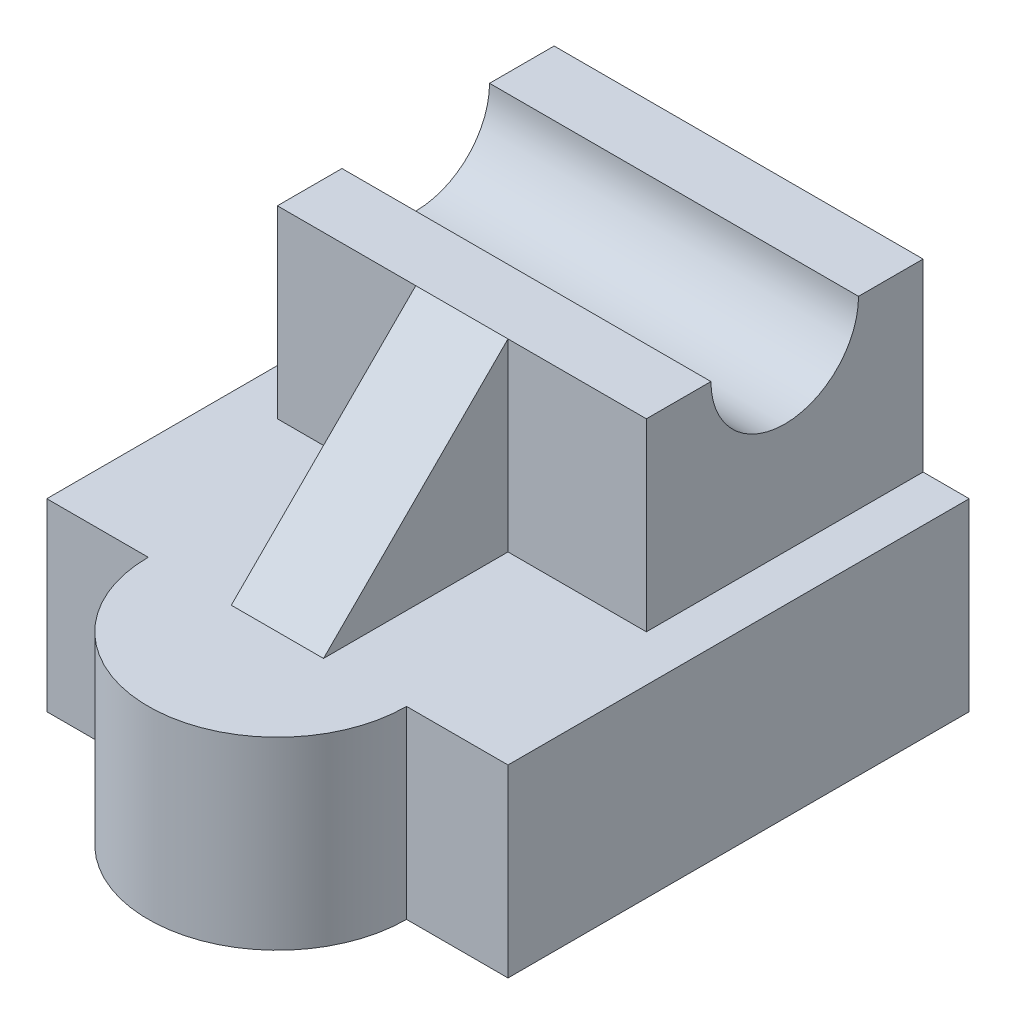
ISO-10303-21;
HEADER;
FILE_DESCRIPTION(('STEP AP214'),'2;1');
FILE_NAME('part.step','',(''),(''),'','','');
FILE_SCHEMA(('AUTOMOTIVE_DESIGN { 1 0 10303 214 1 1 1 1 }'));
ENDSEC;
DATA;
#1=APPLICATION_CONTEXT('core data for automotive mechanical design processes');
#2=APPLICATION_PROTOCOL_DEFINITION('international standard','automotive_design',2000,#1);
#3=PRODUCT_CONTEXT('',#1,'mechanical');
#4=PRODUCT('Part','Part','',(#3));
#5=PRODUCT_RELATED_PRODUCT_CATEGORY('part','',(#4));
#6=PRODUCT_DEFINITION_FORMATION('','',#4);
#7=PRODUCT_DEFINITION_CONTEXT('part definition',#1,'design');
#8=PRODUCT_DEFINITION('design','',#6,#7);
#9=PRODUCT_DEFINITION_SHAPE('','',#8);
#10=(LENGTH_UNIT() NAMED_UNIT(*) SI_UNIT(.MILLI.,.METRE.));
#11=(NAMED_UNIT(*) PLANE_ANGLE_UNIT() SI_UNIT($,.RADIAN.));
#12=(NAMED_UNIT(*) SI_UNIT($,.STERADIAN.) SOLID_ANGLE_UNIT());
#13=UNCERTAINTY_MEASURE_WITH_UNIT(LENGTH_MEASURE(1.E-05),#10,'distance_accuracy_value','');
#14=(GEOMETRIC_REPRESENTATION_CONTEXT(3) GLOBAL_UNCERTAINTY_ASSIGNED_CONTEXT((#13)) GLOBAL_UNIT_ASSIGNED_CONTEXT((#10,
#11,#12)) REPRESENTATION_CONTEXT('',''));
#15=CARTESIAN_POINT('',(0.,0.,0.));
#16=DIRECTION('',(0.,0.,1.));
#17=DIRECTION('',(1.,0.,0.));
#18=AXIS2_PLACEMENT_3D('',#15,#16,#17);
#19=CARTESIAN_POINT('',(20.,40.,30.));
#20=DIRECTION('',(0.,0.,-1.));
#21=DIRECTION('',(-1.,0.,0.));
#22=AXIS2_PLACEMENT_3D('',#19,#20,#21);
#23=PLANE('',#22);
#24=DIRECTION('',(0.,1.,0.));
#25=VECTOR('',#24,1.);
#26=CARTESIAN_POINT('',(5.,20.,30.));
#27=LINE('',#26,#25);
#28=CARTESIAN_POINT('',(5.,20.,30.));
#29=VERTEX_POINT('',#28);
#30=CARTESIAN_POINT('',(5.,40.,30.));
#31=VERTEX_POINT('',#30);
#32=EDGE_CURVE('E165',#29,#31,#27,.T.);
#33=ORIENTED_EDGE('',*,*,#32,.F.);
#34=DIRECTION('',(1.,0.,0.));
#35=VECTOR('',#34,1.);
#36=CARTESIAN_POINT('',(20.,20.,30.));
#37=LINE('',#36,#35);
#38=CARTESIAN_POINT('',(20.,20.,30.));
#39=VERTEX_POINT('',#38);
#40=EDGE_CURVE('E157',#29,#39,#37,.T.);
#41=ORIENTED_EDGE('',*,*,#40,.T.);
#42=DIRECTION('',(0.,-1.,0.));
#43=VECTOR('',#42,1.);
#44=CARTESIAN_POINT('',(20.,40.,30.));
#45=LINE('',#44,#43);
#46=CARTESIAN_POINT('',(20.,40.,30.));
#47=VERTEX_POINT('',#46);
#48=EDGE_CURVE('E226',#47,#39,#45,.T.);
#49=ORIENTED_EDGE('',*,*,#48,.F.);
#50=DIRECTION('',(1.,0.,0.));
#51=VECTOR('',#50,1.);
#52=CARTESIAN_POINT('',(20.,40.,30.));
#53=LINE('',#52,#51);
#54=EDGE_CURVE('E59',#31,#47,#53,.T.);
#55=ORIENTED_EDGE('',*,*,#54,.F.);
#56=EDGE_LOOP('',(#33,#41,#49,#55));
#57=FACE_BOUND('',#56,.T.);
#58=ADVANCED_FACE('F43',(#57),#23,.F.);
#59=CARTESIAN_POINT('',(0.,0.,50.));
#60=DIRECTION('',(0.,0.,1.));
#61=DIRECTION('',(1.,0.,0.));
#62=AXIS2_PLACEMENT_3D('',#59,#60,#61);
#63=PLANE('',#62);
#64=DIRECTION('',(1.,0.,0.));
#65=VECTOR('',#64,1.);
#66=CARTESIAN_POINT('',(-25.,0.,50.));
#67=LINE('',#66,#65);
#68=CARTESIAN_POINT('',(-25.,0.,50.));
#69=VERTEX_POINT('',#68);
#70=CARTESIAN_POINT('',(-14.,0.,50.));
#71=VERTEX_POINT('',#70);
#72=EDGE_CURVE('E236',#69,#71,#67,.T.);
#73=ORIENTED_EDGE('',*,*,#72,.T.);
#74=DIRECTION('',(0.,1.,0.));
#75=VECTOR('',#74,1.);
#76=CARTESIAN_POINT('',(-14.,0.,50.));
#77=LINE('',#76,#75);
#78=CARTESIAN_POINT('',(-14.,20.,50.));
#79=VERTEX_POINT('',#78);
#80=EDGE_CURVE('E186',#71,#79,#77,.T.);
#81=ORIENTED_EDGE('',*,*,#80,.T.);
#82=DIRECTION('',(-1.,0.,0.));
#83=VECTOR('',#82,1.);
#84=CARTESIAN_POINT('',(25.,20.,50.));
#85=LINE('',#84,#83);
#86=CARTESIAN_POINT('',(-25.,20.,50.));
#87=VERTEX_POINT('',#86);
#88=EDGE_CURVE('E242',#79,#87,#85,.T.);
#89=ORIENTED_EDGE('',*,*,#88,.T.);
#90=DIRECTION('',(0.,-1.,0.));
#91=VECTOR('',#90,1.);
#92=CARTESIAN_POINT('',(-25.,20.,50.));
#93=LINE('',#92,#91);
#94=EDGE_CURVE('E234',#87,#69,#93,.T.);
#95=ORIENTED_EDGE('',*,*,#94,.T.);
#96=EDGE_LOOP('',(#73,#81,#89,#95));
#97=FACE_BOUND('',#96,.T.);
#98=ADVANCED_FACE('F296',(#97),#63,.T.);
#99=CARTESIAN_POINT('',(0.,40.,0.));
#100=DIRECTION('',(0.,-1.,0.));
#101=DIRECTION('',(0.,0.,-1.));
#102=AXIS2_PLACEMENT_3D('',#99,#100,#101);
#103=PLANE('',#102);
#104=DIRECTION('',(1.,0.,0.));
#105=VECTOR('',#104,1.);
#106=CARTESIAN_POINT('',(-25.,40.,23.));
#107=LINE('',#106,#105);
#108=CARTESIAN_POINT('',(-20.,40.,23.));
#109=VERTEX_POINT('',#108);
#110=CARTESIAN_POINT('',(20.,40.,23.));
#111=VERTEX_POINT('',#110);
#112=EDGE_CURVE('E194',#109,#111,#107,.T.);
#113=ORIENTED_EDGE('',*,*,#112,.F.);
#114=DIRECTION('',(0.,0.,1.));
#115=VECTOR('',#114,1.);
#116=CARTESIAN_POINT('',(-20.,40.,30.));
#117=LINE('',#116,#115);
#118=CARTESIAN_POINT('',(-20.,40.,30.));
#119=VERTEX_POINT('',#118);
#120=EDGE_CURVE('E204',#109,#119,#117,.T.);
#121=ORIENTED_EDGE('',*,*,#120,.T.);
#122=CARTESIAN_POINT('',(-5.,40.,30.));
#123=VERTEX_POINT('',#122);
#124=EDGE_CURVE('E202',#119,#123,#53,.T.);
#125=ORIENTED_EDGE('',*,*,#124,.T.);
#126=DIRECTION('',(-1.,0.,0.));
#127=VECTOR('',#126,1.);
#128=CARTESIAN_POINT('',(5.,40.,30.));
#129=LINE('',#128,#127);
#130=EDGE_CURVE('E173',#31,#123,#129,.T.);
#131=ORIENTED_EDGE('',*,*,#130,.F.);
#132=ORIENTED_EDGE('',*,*,#54,.T.);
#133=DIRECTION('',(0.,0.,-1.));
#134=VECTOR('',#133,1.);
#135=CARTESIAN_POINT('',(20.,40.,0.));
#136=LINE('',#135,#134);
#137=EDGE_CURVE('E208',#47,#111,#136,.T.);
#138=ORIENTED_EDGE('',*,*,#137,.T.);
#139=EDGE_LOOP('',(#113,#121,#125,#131,#132,#138));
#140=FACE_BOUND('',#139,.T.);
#141=ADVANCED_FACE('F304',(#140),#103,.F.);
#142=CARTESIAN_POINT('',(20.,40.,0.));
#143=DIRECTION('',(-1.,0.,0.));
#144=DIRECTION('',(0.,0.,1.));
#145=AXIS2_PLACEMENT_3D('',#142,#143,#144);
#146=PLANE('',#145);
#147=CARTESIAN_POINT('',(20.,40.,15.));
#148=DIRECTION('',(1.,0.,0.));
#149=DIRECTION('',(0.,0.,1.));
#150=AXIS2_PLACEMENT_3D('',#147,#148,#149);
#151=CIRCLE('',#150,8.);
#152=CARTESIAN_POINT('',(20.,40.,7.));
#153=VERTEX_POINT('',#152);
#154=EDGE_CURVE('E188',#111,#153,#151,.T.);
#155=ORIENTED_EDGE('',*,*,#154,.F.);
#156=ORIENTED_EDGE('',*,*,#137,.F.);
#157=ORIENTED_EDGE('',*,*,#48,.T.);
#158=DIRECTION('',(0.,0.,-1.));
#159=VECTOR('',#158,1.);
#160=CARTESIAN_POINT('',(20.,20.,0.));
#161=LINE('',#160,#159);
#162=CARTESIAN_POINT('',(20.,20.,0.));
#163=VERTEX_POINT('',#162);
#164=EDGE_CURVE('E217',#39,#163,#161,.T.);
#165=ORIENTED_EDGE('',*,*,#164,.T.);
#166=DIRECTION('',(0.,-1.,0.));
#167=VECTOR('',#166,1.);
#168=CARTESIAN_POINT('',(20.,40.,0.));
#169=LINE('',#168,#167);
#170=CARTESIAN_POINT('',(20.,40.,0.));
#171=VERTEX_POINT('',#170);
#172=EDGE_CURVE('E224',#171,#163,#169,.T.);
#173=ORIENTED_EDGE('',*,*,#172,.F.);
#174=EDGE_CURVE('E210',#153,#171,#136,.T.);
#175=ORIENTED_EDGE('',*,*,#174,.F.);
#176=EDGE_LOOP('',(#155,#156,#157,#165,#173,#175));
#177=FACE_BOUND('',#176,.T.);
#178=ADVANCED_FACE('F279',(#177),#146,.F.);
#179=CARTESIAN_POINT('',(25.,20.,50.));
#180=DIRECTION('',(0.,-1.,0.));
#181=DIRECTION('',(0.,0.,-1.));
#182=AXIS2_PLACEMENT_3D('',#179,#180,#181);
#183=PLANE('',#182);
#184=DIRECTION('',(-1.,0.,0.));
#185=VECTOR('',#184,1.);
#186=CARTESIAN_POINT('',(5.,20.,50.));
#187=LINE('',#186,#185);
#188=CARTESIAN_POINT('',(5.,20.,50.));
#189=VERTEX_POINT('',#188);
#190=CARTESIAN_POINT('',(-5.,20.,50.));
#191=VERTEX_POINT('',#190);
#192=EDGE_CURVE('E156',#189,#191,#187,.T.);
#193=ORIENTED_EDGE('',*,*,#192,.T.);
#194=DIRECTION('',(0.,0.,-1.));
#195=VECTOR('',#194,1.);
#196=CARTESIAN_POINT('',(-5.,20.,50.));
#197=LINE('',#196,#195);
#198=CARTESIAN_POINT('',(-5.,20.,30.));
#199=VERTEX_POINT('',#198);
#200=EDGE_CURVE('E282',#191,#199,#197,.T.);
#201=ORIENTED_EDGE('',*,*,#200,.T.);
#202=CARTESIAN_POINT('',(-20.,20.,30.));
#203=VERTEX_POINT('',#202);
#204=EDGE_CURVE('E216',#203,#199,#37,.T.);
#205=ORIENTED_EDGE('',*,*,#204,.F.);
#206=DIRECTION('',(0.,0.,1.));
#207=VECTOR('',#206,1.);
#208=CARTESIAN_POINT('',(-20.,20.,30.));
#209=LINE('',#208,#207);
#210=CARTESIAN_POINT('',(-20.,20.,0.));
#211=VERTEX_POINT('',#210);
#212=EDGE_CURVE('E199',#211,#203,#209,.T.);
#213=ORIENTED_EDGE('',*,*,#212,.F.);
#214=DIRECTION('',(-1.,0.,0.));
#215=VECTOR('',#214,1.);
#216=CARTESIAN_POINT('',(25.,20.,0.));
#217=LINE('',#216,#215);
#218=CARTESIAN_POINT('',(-25.,20.,0.));
#219=VERTEX_POINT('',#218);
#220=EDGE_CURVE('E255',#211,#219,#217,.T.);
#221=ORIENTED_EDGE('',*,*,#220,.T.);
#222=DIRECTION('',(0.,0.,-1.));
#223=VECTOR('',#222,1.);
#224=CARTESIAN_POINT('',(-25.,20.,50.));
#225=LINE('',#224,#223);
#226=EDGE_CURVE('E250',#87,#219,#225,.T.);
#227=ORIENTED_EDGE('',*,*,#226,.F.);
#228=ORIENTED_EDGE('',*,*,#88,.F.);
#229=CARTESIAN_POINT('',(0.,20.,50.));
#230=DIRECTION('',(0.,1.,0.));
#231=DIRECTION('',(0.,0.,1.));
#232=AXIS2_PLACEMENT_3D('',#229,#230,#231);
#233=CIRCLE('',#232,14.);
#234=CARTESIAN_POINT('',(14.,20.,50.));
#235=VERTEX_POINT('',#234);
#236=EDGE_CURVE('E177',#79,#235,#233,.T.);
#237=ORIENTED_EDGE('',*,*,#236,.T.);
#238=CARTESIAN_POINT('',(25.,20.,50.));
#239=VERTEX_POINT('',#238);
#240=EDGE_CURVE('E243',#239,#235,#85,.T.);
#241=ORIENTED_EDGE('',*,*,#240,.F.);
#242=DIRECTION('',(0.,0.,-1.));
#243=VECTOR('',#242,1.);
#244=CARTESIAN_POINT('',(25.,20.,50.));
#245=LINE('',#244,#243);
#246=CARTESIAN_POINT('',(25.,20.,0.));
#247=VERTEX_POINT('',#246);
#248=EDGE_CURVE('E256',#239,#247,#245,.T.);
#249=ORIENTED_EDGE('',*,*,#248,.T.);
#250=EDGE_CURVE('E240',#247,#163,#217,.T.);
#251=ORIENTED_EDGE('',*,*,#250,.T.);
#252=ORIENTED_EDGE('',*,*,#164,.F.);
#253=ORIENTED_EDGE('',*,*,#40,.F.);
#254=DIRECTION('',(0.,0.,-1.));
#255=VECTOR('',#254,1.);
#256=CARTESIAN_POINT('',(5.,20.,50.));
#257=LINE('',#256,#255);
#258=EDGE_CURVE('E155',#189,#29,#257,.T.);
#259=ORIENTED_EDGE('',*,*,#258,.F.);
#260=EDGE_LOOP('',(#193,#201,#205,#213,#221,#227,#228,#237,#241,#249,#251,#252,#253,#259));
#261=FACE_BOUND('',#260,.T.);
#262=ADVANCED_FACE('F152',(#261),#183,.F.);
#263=CARTESIAN_POINT('',(-25.,20.,50.));
#264=DIRECTION('',(1.,0.,0.));
#265=DIRECTION('',(0.,0.,-1.));
#266=AXIS2_PLACEMENT_3D('',#263,#264,#265);
#267=PLANE('',#266);
#268=DIRECTION('',(0.,-1.,0.));
#269=VECTOR('',#268,1.);
#270=CARTESIAN_POINT('',(-25.,20.,0.));
#271=LINE('',#270,#269);
#272=CARTESIAN_POINT('',(-25.,0.,0.));
#273=VERTEX_POINT('',#272);
#274=EDGE_CURVE('E235',#219,#273,#271,.T.);
#275=ORIENTED_EDGE('',*,*,#274,.T.);
#276=DIRECTION('',(0.,0.,-1.));
#277=VECTOR('',#276,1.);
#278=CARTESIAN_POINT('',(-25.,0.,50.));
#279=LINE('',#278,#277);
#280=EDGE_CURVE('E11',#69,#273,#279,.T.);
#281=ORIENTED_EDGE('',*,*,#280,.F.);
#282=ORIENTED_EDGE('',*,*,#94,.F.);
#283=ORIENTED_EDGE('',*,*,#226,.T.);
#284=EDGE_LOOP('',(#275,#281,#282,#283));
#285=FACE_BOUND('',#284,.T.);
#286=ADVANCED_FACE('F44',(#285),#267,.F.);
#287=CARTESIAN_POINT('',(-25.,0.,50.));
#288=DIRECTION('',(0.,1.,0.));
#289=DIRECTION('',(0.,0.,1.));
#290=AXIS2_PLACEMENT_3D('',#287,#288,#289);
#291=PLANE('',#290);
#292=DIRECTION('',(1.,0.,0.));
#293=VECTOR('',#292,1.);
#294=CARTESIAN_POINT('',(-25.,0.,0.));
#295=LINE('',#294,#293);
#296=CARTESIAN_POINT('',(25.,0.,0.));
#297=VERTEX_POINT('',#296);
#298=EDGE_CURVE('E248',#273,#297,#295,.T.);
#299=ORIENTED_EDGE('',*,*,#298,.T.);
#300=DIRECTION('',(0.,0.,-1.));
#301=VECTOR('',#300,1.);
#302=CARTESIAN_POINT('',(25.,0.,50.));
#303=LINE('',#302,#301);
#304=CARTESIAN_POINT('',(25.,0.,50.));
#305=VERTEX_POINT('',#304);
#306=EDGE_CURVE('E51',#305,#297,#303,.T.);
#307=ORIENTED_EDGE('',*,*,#306,.F.);
#308=CARTESIAN_POINT('',(14.,0.,50.));
#309=VERTEX_POINT('',#308);
#310=EDGE_CURVE('E237',#309,#305,#67,.T.);
#311=ORIENTED_EDGE('',*,*,#310,.F.);
#312=CARTESIAN_POINT('',(0.,0.,50.));
#313=DIRECTION('',(0.,1.,0.));
#314=DIRECTION('',(0.,0.,1.));
#315=AXIS2_PLACEMENT_3D('',#312,#313,#314);
#316=CIRCLE('',#315,14.);
#317=EDGE_CURVE('E182',#71,#309,#316,.T.);
#318=ORIENTED_EDGE('',*,*,#317,.F.);
#319=ORIENTED_EDGE('',*,*,#72,.F.);
#320=ORIENTED_EDGE('',*,*,#280,.T.);
#321=EDGE_LOOP('',(#299,#307,#311,#318,#319,#320));
#322=FACE_BOUND('',#321,.T.);
#323=ADVANCED_FACE('F334',(#322),#291,.F.);
#324=CARTESIAN_POINT('',(25.,0.,50.));
#325=DIRECTION('',(-1.,0.,0.));
#326=DIRECTION('',(0.,0.,1.));
#327=AXIS2_PLACEMENT_3D('',#324,#325,#326);
#328=PLANE('',#327);
#329=DIRECTION('',(0.,1.,0.));
#330=VECTOR('',#329,1.);
#331=CARTESIAN_POINT('',(25.,0.,0.));
#332=LINE('',#331,#330);
#333=EDGE_CURVE('E252',#297,#247,#332,.T.);
#334=ORIENTED_EDGE('',*,*,#333,.T.);
#335=ORIENTED_EDGE('',*,*,#248,.F.);
#336=DIRECTION('',(0.,1.,0.));
#337=VECTOR('',#336,1.);
#338=CARTESIAN_POINT('',(25.,0.,50.));
#339=LINE('',#338,#337);
#340=EDGE_CURVE('E241',#305,#239,#339,.T.);
#341=ORIENTED_EDGE('',*,*,#340,.F.);
#342=ORIENTED_EDGE('',*,*,#306,.T.);
#343=EDGE_LOOP('',(#334,#335,#341,#342));
#344=FACE_BOUND('',#343,.T.);
#345=ADVANCED_FACE('F264',(#344),#328,.F.);
#346=DIRECTION('',(0.,1.,0.));
#347=VECTOR('',#346,1.);
#348=CARTESIAN_POINT('',(14.,0.,50.));
#349=LINE('',#348,#347);
#350=EDGE_CURVE('E181',#309,#235,#349,.T.);
#351=ORIENTED_EDGE('',*,*,#350,.F.);
#352=ORIENTED_EDGE('',*,*,#310,.T.);
#353=ORIENTED_EDGE('',*,*,#340,.T.);
#354=ORIENTED_EDGE('',*,*,#240,.T.);
#355=EDGE_LOOP('',(#351,#352,#353,#354));
#356=FACE_BOUND('',#355,.T.);
#357=ADVANCED_FACE('F308',(#356),#63,.T.);
#358=CARTESIAN_POINT('',(0.,0.,0.));
#359=DIRECTION('',(0.,0.,1.));
#360=DIRECTION('',(1.,0.,0.));
#361=AXIS2_PLACEMENT_3D('',#358,#359,#360);
#362=PLANE('',#361);
#363=ORIENTED_EDGE('',*,*,#274,.F.);
#364=ORIENTED_EDGE('',*,*,#220,.F.);
#365=DIRECTION('',(0.,-1.,0.));
#366=VECTOR('',#365,1.);
#367=CARTESIAN_POINT('',(-20.,40.,0.));
#368=LINE('',#367,#366);
#369=CARTESIAN_POINT('',(-20.,40.,0.));
#370=VERTEX_POINT('',#369);
#371=EDGE_CURVE('E213',#370,#211,#368,.T.);
#372=ORIENTED_EDGE('',*,*,#371,.F.);
#373=DIRECTION('',(-1.,0.,0.));
#374=VECTOR('',#373,1.);
#375=CARTESIAN_POINT('',(-20.,40.,0.));
#376=LINE('',#375,#374);
#377=EDGE_CURVE('E211',#171,#370,#376,.T.);
#378=ORIENTED_EDGE('',*,*,#377,.F.);
#379=ORIENTED_EDGE('',*,*,#172,.T.);
#380=ORIENTED_EDGE('',*,*,#250,.F.);
#381=ORIENTED_EDGE('',*,*,#333,.F.);
#382=ORIENTED_EDGE('',*,*,#298,.F.);
#383=EDGE_LOOP('',(#363,#364,#372,#378,#379,#380,#381,#382));
#384=FACE_BOUND('',#383,.T.);
#385=ADVANCED_FACE('F275',(#384),#362,.F.);
#386=CARTESIAN_POINT('',(-20.,40.,30.));
#387=DIRECTION('',(1.,0.,0.));
#388=DIRECTION('',(0.,0.,-1.));
#389=AXIS2_PLACEMENT_3D('',#386,#387,#388);
#390=PLANE('',#389);
#391=ORIENTED_EDGE('',*,*,#120,.F.);
#392=CARTESIAN_POINT('',(-20.,40.,15.));
#393=DIRECTION('',(1.,0.,0.));
#394=DIRECTION('',(0.,0.,-1.));
#395=AXIS2_PLACEMENT_3D('',#392,#393,#394);
#396=CIRCLE('',#395,8.);
#397=CARTESIAN_POINT('',(-20.,40.,7.));
#398=VERTEX_POINT('',#397);
#399=EDGE_CURVE('E193',#109,#398,#396,.T.);
#400=ORIENTED_EDGE('',*,*,#399,.T.);
#401=EDGE_CURVE('E203',#370,#398,#117,.T.);
#402=ORIENTED_EDGE('',*,*,#401,.F.);
#403=ORIENTED_EDGE('',*,*,#371,.T.);
#404=ORIENTED_EDGE('',*,*,#212,.T.);
#405=DIRECTION('',(0.,-1.,0.));
#406=VECTOR('',#405,1.);
#407=CARTESIAN_POINT('',(-20.,40.,30.));
#408=LINE('',#407,#406);
#409=EDGE_CURVE('E228',#119,#203,#408,.T.);
#410=ORIENTED_EDGE('',*,*,#409,.F.);
#411=EDGE_LOOP('',(#391,#400,#402,#403,#404,#410));
#412=FACE_BOUND('',#411,.T.);
#413=ADVANCED_FACE('F313',(#412),#390,.F.);
#414=ORIENTED_EDGE('',*,*,#204,.T.);
#415=DIRECTION('',(0.,1.,0.));
#416=VECTOR('',#415,1.);
#417=CARTESIAN_POINT('',(-5.,20.,30.));
#418=LINE('',#417,#416);
#419=EDGE_CURVE('E67',#199,#123,#418,.T.);
#420=ORIENTED_EDGE('',*,*,#419,.T.);
#421=ORIENTED_EDGE('',*,*,#124,.F.);
#422=ORIENTED_EDGE('',*,*,#409,.T.);
#423=EDGE_LOOP('',(#414,#420,#421,#422));
#424=FACE_BOUND('',#423,.T.);
#425=ADVANCED_FACE('F284',(#424),#23,.F.);
#426=ORIENTED_EDGE('',*,*,#401,.T.);
#427=DIRECTION('',(1.,0.,0.));
#428=VECTOR('',#427,1.);
#429=CARTESIAN_POINT('',(-25.,40.,7.));
#430=LINE('',#429,#428);
#431=EDGE_CURVE('E195',#398,#153,#430,.T.);
#432=ORIENTED_EDGE('',*,*,#431,.T.);
#433=ORIENTED_EDGE('',*,*,#174,.T.);
#434=ORIENTED_EDGE('',*,*,#377,.T.);
#435=EDGE_LOOP('',(#426,#432,#433,#434));
#436=FACE_BOUND('',#435,.T.);
#437=ADVANCED_FACE('F309',(#436),#103,.F.);
#438=CARTESIAN_POINT('',(-25.,40.,15.));
#439=DIRECTION('',(1.,0.,0.));
#440=DIRECTION('',(0.,0.,-1.));
#441=AXIS2_PLACEMENT_3D('',#438,#439,#440);
#442=CYLINDRICAL_SURFACE('',#441,8.);
#443=ORIENTED_EDGE('',*,*,#112,.T.);
#444=ORIENTED_EDGE('',*,*,#154,.T.);
#445=ORIENTED_EDGE('',*,*,#431,.F.);
#446=ORIENTED_EDGE('',*,*,#399,.F.);
#447=EDGE_LOOP('',(#443,#444,#445,#446));
#448=FACE_BOUND('',#447,.T.);
#449=ADVANCED_FACE('F320',(#448),#442,.F.);
#450=CARTESIAN_POINT('',(0.,0.,50.));
#451=DIRECTION('',(0.,1.,0.));
#452=DIRECTION('',(0.,0.,1.));
#453=AXIS2_PLACEMENT_3D('',#450,#451,#452);
#454=CYLINDRICAL_SURFACE('',#453,14.);
#455=ORIENTED_EDGE('',*,*,#236,.F.);
#456=ORIENTED_EDGE('',*,*,#80,.F.);
#457=ORIENTED_EDGE('',*,*,#317,.T.);
#458=ORIENTED_EDGE('',*,*,#350,.T.);
#459=EDGE_LOOP('',(#455,#456,#457,#458));
#460=FACE_BOUND('',#459,.T.);
#461=ADVANCED_FACE('F348',(#460),#454,.T.);
#462=CARTESIAN_POINT('',(5.,40.,30.));
#463=DIRECTION('',(0.,-0.707106781186548,-0.707106781186547));
#464=DIRECTION('',(0.,0.707106781186547,-0.707106781186548));
#465=AXIS2_PLACEMENT_3D('',#462,#463,#464);
#466=PLANE('',#465);
#467=DIRECTION('',(0.,-0.707106781186547,0.707106781186548));
#468=VECTOR('',#467,1.);
#469=CARTESIAN_POINT('',(-5.,40.,30.));
#470=LINE('',#469,#468);
#471=EDGE_CURVE('E162',#123,#191,#470,.T.);
#472=ORIENTED_EDGE('',*,*,#471,.T.);
#473=ORIENTED_EDGE('',*,*,#192,.F.);
#474=DIRECTION('',(0.,-0.707106781186547,0.707106781186548));
#475=VECTOR('',#474,1.);
#476=CARTESIAN_POINT('',(5.,40.,30.));
#477=LINE('',#476,#475);
#478=EDGE_CURVE('E167',#31,#189,#477,.T.);
#479=ORIENTED_EDGE('',*,*,#478,.F.);
#480=ORIENTED_EDGE('',*,*,#130,.T.);
#481=EDGE_LOOP('',(#472,#473,#479,#480));
#482=FACE_BOUND('',#481,.T.);
#483=ADVANCED_FACE('F171',(#482),#466,.F.);
#484=CARTESIAN_POINT('',(5.,0.,0.));
#485=DIRECTION('',(1.,0.,0.));
#486=DIRECTION('',(0.,0.,-1.));
#487=AXIS2_PLACEMENT_3D('',#484,#485,#486);
#488=PLANE('',#487);
#489=ORIENTED_EDGE('',*,*,#258,.T.);
#490=ORIENTED_EDGE('',*,*,#32,.T.);
#491=ORIENTED_EDGE('',*,*,#478,.T.);
#492=EDGE_LOOP('',(#489,#490,#491));
#493=FACE_BOUND('',#492,.T.);
#494=ADVANCED_FACE('F170',(#493),#488,.T.);
#495=CARTESIAN_POINT('',(-5.,0.,0.));
#496=DIRECTION('',(1.,0.,0.));
#497=DIRECTION('',(0.,0.,-1.));
#498=AXIS2_PLACEMENT_3D('',#495,#496,#497);
#499=PLANE('',#498);
#500=ORIENTED_EDGE('',*,*,#200,.F.);
#501=ORIENTED_EDGE('',*,*,#471,.F.);
#502=ORIENTED_EDGE('',*,*,#419,.F.);
#503=EDGE_LOOP('',(#500,#501,#502));
#504=FACE_BOUND('',#503,.T.);
#505=ADVANCED_FACE('F290',(#504),#499,.F.);
#506=CLOSED_SHELL('',(#58,#98,#141,#178,#262,#286,#323,#345,#357,#385,#413,#425,#437,#449,#461,
#483,#494,#505));
#507=MANIFOLD_SOLID_BREP('B2',#506);
#508=ADVANCED_BREP_SHAPE_REPRESENTATION('',(#18,#507),#14);
#509=SHAPE_DEFINITION_REPRESENTATION(#9,#508);
ENDSEC;
END-ISO-10303-21;
